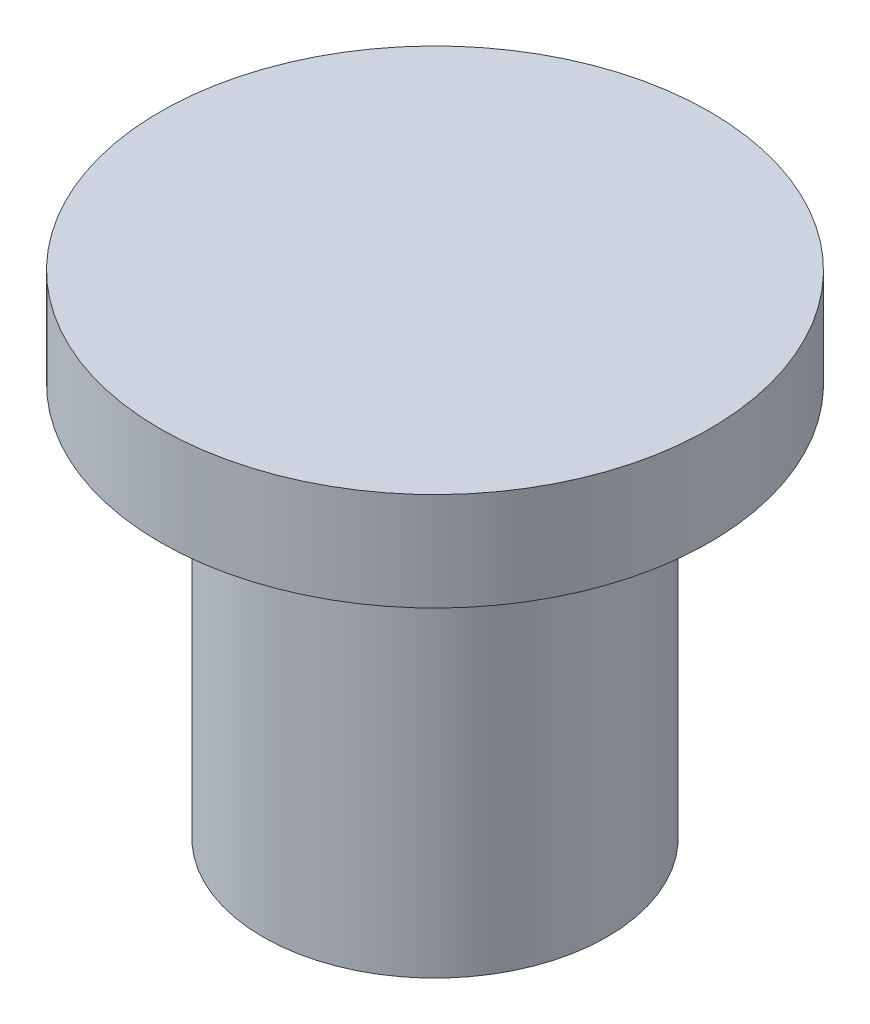
ISO-10303-21;
HEADER;
FILE_DESCRIPTION(('STEP AP214'),'2;1');
FILE_NAME('part.step','',(''),(''),'','','');
FILE_SCHEMA(('AUTOMOTIVE_DESIGN { 1 0 10303 214 1 1 1 1 }'));
ENDSEC;
DATA;
#1=APPLICATION_CONTEXT('core data for automotive mechanical design processes');
#2=APPLICATION_PROTOCOL_DEFINITION('international standard','automotive_design',2000,#1);
#3=PRODUCT_CONTEXT('',#1,'mechanical');
#4=PRODUCT('Part','Part','',(#3));
#5=PRODUCT_RELATED_PRODUCT_CATEGORY('part','',(#4));
#6=PRODUCT_DEFINITION_FORMATION('','',#4);
#7=PRODUCT_DEFINITION_CONTEXT('part definition',#1,'design');
#8=PRODUCT_DEFINITION('design','',#6,#7);
#9=PRODUCT_DEFINITION_SHAPE('','',#8);
#10=(LENGTH_UNIT() NAMED_UNIT(*) SI_UNIT(.MILLI.,.METRE.));
#11=(NAMED_UNIT(*) PLANE_ANGLE_UNIT() SI_UNIT($,.RADIAN.));
#12=(NAMED_UNIT(*) SI_UNIT($,.STERADIAN.) SOLID_ANGLE_UNIT());
#13=UNCERTAINTY_MEASURE_WITH_UNIT(LENGTH_MEASURE(1.E-05),#10,'distance_accuracy_value','');
#14=(GEOMETRIC_REPRESENTATION_CONTEXT(3) GLOBAL_UNCERTAINTY_ASSIGNED_CONTEXT((#13)) GLOBAL_UNIT_ASSIGNED_CONTEXT((#10,
#11,#12)) REPRESENTATION_CONTEXT('',''));
#15=CARTESIAN_POINT('',(0.,0.,0.));
#16=DIRECTION('',(0.,0.,1.));
#17=DIRECTION('',(1.,0.,0.));
#18=AXIS2_PLACEMENT_3D('',#15,#16,#17);
#19=CARTESIAN_POINT('',(0.,-4.,0.));
#20=DIRECTION('',(0.,1.,0.));
#21=DIRECTION('',(0.,0.,1.));
#22=AXIS2_PLACEMENT_3D('',#19,#20,#21);
#23=CYLINDRICAL_SURFACE('',#22,1.75);
#24=CARTESIAN_POINT('',(0.,-4.,0.));
#25=DIRECTION('',(0.,1.,0.));
#26=DIRECTION('',(0.,0.,1.));
#27=AXIS2_PLACEMENT_3D('',#24,#25,#26);
#28=CIRCLE('',#27,1.75);
#29=CARTESIAN_POINT('',(0.,-4.,1.75));
#30=VERTEX_POINT('',#29);
#31=EDGE_CURVE('E10',#30,#30,#28,.T.);
#32=ORIENTED_EDGE('',*,*,#31,.T.);
#33=EDGE_LOOP('',(#32));
#34=FACE_BOUND('',#33,.T.);
#35=CARTESIAN_POINT('',(0.,0.,0.));
#36=DIRECTION('',(0.,1.,0.));
#37=DIRECTION('',(0.,0.,1.));
#38=AXIS2_PLACEMENT_3D('',#35,#36,#37);
#39=CIRCLE('',#38,1.75);
#40=CARTESIAN_POINT('',(0.,0.,1.75));
#41=VERTEX_POINT('',#40);
#42=EDGE_CURVE('E40',#41,#41,#39,.T.);
#43=ORIENTED_EDGE('',*,*,#42,.F.);
#44=EDGE_LOOP('',(#43));
#45=FACE_BOUND('',#44,.T.);
#46=ADVANCED_FACE('F37',(#34,#45),#23,.T.);
#47=CARTESIAN_POINT('',(0.,-4.,0.));
#48=DIRECTION('',(0.,1.,0.));
#49=DIRECTION('',(0.,0.,1.));
#50=AXIS2_PLACEMENT_3D('',#47,#48,#49);
#51=PLANE('',#50);
#52=ORIENTED_EDGE('',*,*,#31,.F.);
#53=EDGE_LOOP('',(#52));
#54=FACE_BOUND('',#53,.T.);
#55=ADVANCED_FACE('F60',(#54),#51,.F.);
#56=CARTESIAN_POINT('',(0.,1.,0.));
#57=DIRECTION('',(0.,-1.,0.));
#58=DIRECTION('',(0.,0.,-1.));
#59=AXIS2_PLACEMENT_3D('',#56,#57,#58);
#60=CYLINDRICAL_SURFACE('',#59,2.79527767025704);
#61=CARTESIAN_POINT('',(0.,1.,0.));
#62=DIRECTION('',(0.,1.,0.));
#63=DIRECTION('',(0.,0.,1.));
#64=AXIS2_PLACEMENT_3D('',#61,#62,#63);
#65=CIRCLE('',#64,2.79527767025704);
#66=CARTESIAN_POINT('',(0.,1.,2.79527767025704));
#67=VERTEX_POINT('',#66);
#68=EDGE_CURVE('E47',#67,#67,#65,.T.);
#69=ORIENTED_EDGE('',*,*,#68,.F.);
#70=EDGE_LOOP('',(#69));
#71=FACE_BOUND('',#70,.T.);
#72=CARTESIAN_POINT('',(0.,0.,0.));
#73=DIRECTION('',(0.,1.,0.));
#74=DIRECTION('',(0.,0.,1.));
#75=AXIS2_PLACEMENT_3D('',#72,#73,#74);
#76=CIRCLE('',#75,2.79527767025704);
#77=CARTESIAN_POINT('',(0.,0.,2.79527767025704));
#78=VERTEX_POINT('',#77);
#79=EDGE_CURVE('E49',#78,#78,#76,.T.);
#80=ORIENTED_EDGE('',*,*,#79,.T.);
#81=EDGE_LOOP('',(#80));
#82=FACE_BOUND('',#81,.T.);
#83=ADVANCED_FACE('F57',(#71,#82),#60,.T.);
#84=CARTESIAN_POINT('',(0.,1.,0.));
#85=DIRECTION('',(0.,1.,0.));
#86=DIRECTION('',(0.,0.,1.));
#87=AXIS2_PLACEMENT_3D('',#84,#85,#86);
#88=PLANE('',#87);
#89=ORIENTED_EDGE('',*,*,#68,.T.);
#90=EDGE_LOOP('',(#89));
#91=FACE_BOUND('',#90,.T.);
#92=ADVANCED_FACE('F55',(#91),#88,.T.);
#93=CARTESIAN_POINT('',(0.,0.,0.));
#94=DIRECTION('',(0.,1.,0.));
#95=DIRECTION('',(0.,0.,1.));
#96=AXIS2_PLACEMENT_3D('',#93,#94,#95);
#97=PLANE('',#96);
#98=ORIENTED_EDGE('',*,*,#42,.T.);
#99=EDGE_LOOP('',(#98));
#100=FACE_BOUND('',#99,.T.);
#101=ORIENTED_EDGE('',*,*,#79,.F.);
#102=EDGE_LOOP('',(#101));
#103=FACE_BOUND('',#102,.T.);
#104=ADVANCED_FACE('F64',(#100,#103),#97,.F.);
#105=CLOSED_SHELL('',(#46,#55,#83,#92,#104));
#106=MANIFOLD_SOLID_BREP('B2',#105);
#107=ADVANCED_BREP_SHAPE_REPRESENTATION('',(#18,#106),#14);
#108=SHAPE_DEFINITION_REPRESENTATION(#9,#107);
ENDSEC;
END-ISO-10303-21;
